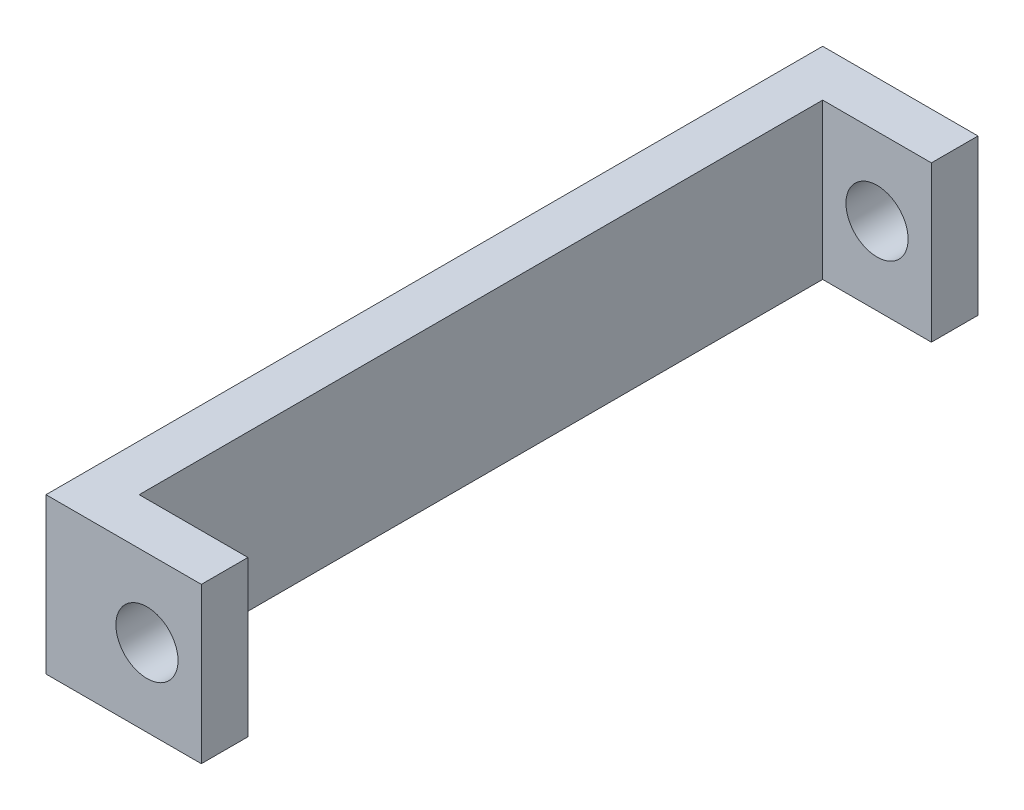
ISO-10303-21;
HEADER;
FILE_DESCRIPTION(('STEP AP214'),'2;1');
FILE_NAME('part.step','',(''),(''),'','','');
FILE_SCHEMA(('AUTOMOTIVE_DESIGN { 1 0 10303 214 1 1 1 1 }'));
ENDSEC;
DATA;
#1=APPLICATION_CONTEXT('core data for automotive mechanical design processes');
#2=APPLICATION_PROTOCOL_DEFINITION('international standard','automotive_design',2000,#1);
#3=PRODUCT_CONTEXT('',#1,'mechanical');
#4=PRODUCT('Part','Part','',(#3));
#5=PRODUCT_RELATED_PRODUCT_CATEGORY('part','',(#4));
#6=PRODUCT_DEFINITION_FORMATION('','',#4);
#7=PRODUCT_DEFINITION_CONTEXT('part definition',#1,'design');
#8=PRODUCT_DEFINITION('design','',#6,#7);
#9=PRODUCT_DEFINITION_SHAPE('','',#8);
#10=(LENGTH_UNIT() NAMED_UNIT(*) SI_UNIT(.MILLI.,.METRE.));
#11=(NAMED_UNIT(*) PLANE_ANGLE_UNIT() SI_UNIT($,.RADIAN.));
#12=(NAMED_UNIT(*) SI_UNIT($,.STERADIAN.) SOLID_ANGLE_UNIT());
#13=UNCERTAINTY_MEASURE_WITH_UNIT(LENGTH_MEASURE(1.E-05),#10,'distance_accuracy_value','');
#14=(GEOMETRIC_REPRESENTATION_CONTEXT(3) GLOBAL_UNCERTAINTY_ASSIGNED_CONTEXT((#13)) GLOBAL_UNIT_ASSIGNED_CONTEXT((#10,
#11,#12)) REPRESENTATION_CONTEXT('',''));
#15=CARTESIAN_POINT('',(0.,0.,0.));
#16=DIRECTION('',(0.,0.,1.));
#17=DIRECTION('',(1.,0.,0.));
#18=AXIS2_PLACEMENT_3D('',#15,#16,#17);
#19=CARTESIAN_POINT('',(5.,5.,50.));
#20=DIRECTION('',(-1.,0.,0.));
#21=DIRECTION('',(0.,0.,1.));
#22=AXIS2_PLACEMENT_3D('',#19,#20,#21);
#23=PLANE('',#22);
#24=DIRECTION('',(0.,0.,-1.));
#25=VECTOR('',#24,1.);
#26=CARTESIAN_POINT('',(5.,5.,50.));
#27=LINE('',#26,#25);
#28=CARTESIAN_POINT('',(5.,5.,3.));
#29=VERTEX_POINT('',#28);
#30=CARTESIAN_POINT('',(5.,5.,0.));
#31=VERTEX_POINT('',#30);
#32=EDGE_CURVE('E188',#29,#31,#27,.T.);
#33=ORIENTED_EDGE('',*,*,#32,.F.);
#34=DIRECTION('',(0.,1.,0.));
#35=VECTOR('',#34,1.);
#36=CARTESIAN_POINT('',(5.,-5.99999999999996,3.));
#37=LINE('',#36,#35);
#38=CARTESIAN_POINT('',(5.,-5.,3.));
#39=VERTEX_POINT('',#38);
#40=EDGE_CURVE('E134',#39,#29,#37,.T.);
#41=ORIENTED_EDGE('',*,*,#40,.F.);
#42=DIRECTION('',(0.,0.,-1.));
#43=VECTOR('',#42,1.);
#44=CARTESIAN_POINT('',(5.,-5.,50.));
#45=LINE('',#44,#43);
#46=CARTESIAN_POINT('',(5.,-5.,0.));
#47=VERTEX_POINT('',#46);
#48=EDGE_CURVE('E91',#39,#47,#45,.T.);
#49=ORIENTED_EDGE('',*,*,#48,.T.);
#50=DIRECTION('',(0.,1.,0.));
#51=VECTOR('',#50,1.);
#52=CARTESIAN_POINT('',(5.,5.,0.));
#53=LINE('',#52,#51);
#54=EDGE_CURVE('E148',#47,#31,#53,.T.);
#55=ORIENTED_EDGE('',*,*,#54,.T.);
#56=EDGE_LOOP('',(#33,#41,#49,#55));
#57=FACE_BOUND('',#56,.T.);
#58=ADVANCED_FACE('F43',(#57),#23,.F.);
#59=CARTESIAN_POINT('',(5.,-5.,50.));
#60=VERTEX_POINT('',#59);
#61=CARTESIAN_POINT('',(5.,-5.,47.));
#62=VERTEX_POINT('',#61);
#63=EDGE_CURVE('E176',#60,#62,#45,.T.);
#64=ORIENTED_EDGE('',*,*,#63,.T.);
#65=DIRECTION('',(0.,1.,0.));
#66=VECTOR('',#65,1.);
#67=CARTESIAN_POINT('',(5.,-5.99999999999996,47.));
#68=LINE('',#67,#66);
#69=CARTESIAN_POINT('',(5.,5.,47.));
#70=VERTEX_POINT('',#69);
#71=EDGE_CURVE('E149',#62,#70,#68,.T.);
#72=ORIENTED_EDGE('',*,*,#71,.T.);
#73=CARTESIAN_POINT('',(5.,5.,50.));
#74=VERTEX_POINT('',#73);
#75=EDGE_CURVE('E189',#74,#70,#27,.T.);
#76=ORIENTED_EDGE('',*,*,#75,.F.);
#77=DIRECTION('',(0.,1.,0.));
#78=VECTOR('',#77,1.);
#79=CARTESIAN_POINT('',(5.,5.,50.));
#80=LINE('',#79,#78);
#81=EDGE_CURVE('E155',#60,#74,#80,.T.);
#82=ORIENTED_EDGE('',*,*,#81,.F.);
#83=EDGE_LOOP('',(#64,#72,#76,#82));
#84=FACE_BOUND('',#83,.T.);
#85=ADVANCED_FACE('F45',(#84),#23,.F.);
#86=CARTESIAN_POINT('',(-5.,5.,50.));
#87=DIRECTION('',(0.,-1.,0.));
#88=DIRECTION('',(0.,0.,-1.));
#89=AXIS2_PLACEMENT_3D('',#86,#87,#88);
#90=PLANE('',#89);
#91=DIRECTION('',(0.,0.,1.));
#92=VECTOR('',#91,1.);
#93=CARTESIAN_POINT('',(-2.,5.,3.));
#94=LINE('',#93,#92);
#95=CARTESIAN_POINT('',(-2.,5.,3.));
#96=VERTEX_POINT('',#95);
#97=CARTESIAN_POINT('',(-1.99999999999999,5.,47.));
#98=VERTEX_POINT('',#97);
#99=EDGE_CURVE('E123',#96,#98,#94,.T.);
#100=ORIENTED_EDGE('',*,*,#99,.F.);
#101=DIRECTION('',(-1.,0.,0.));
#102=VECTOR('',#101,1.);
#103=CARTESIAN_POINT('',(5.,5.,3.));
#104=LINE('',#103,#102);
#105=EDGE_CURVE('E132',#29,#96,#104,.T.);
#106=ORIENTED_EDGE('',*,*,#105,.F.);
#107=ORIENTED_EDGE('',*,*,#32,.T.);
#108=DIRECTION('',(-1.,0.,0.));
#109=VECTOR('',#108,1.);
#110=CARTESIAN_POINT('',(-5.,5.,0.));
#111=LINE('',#110,#109);
#112=CARTESIAN_POINT('',(-5.,5.,0.));
#113=VERTEX_POINT('',#112);
#114=EDGE_CURVE('E168',#31,#113,#111,.T.);
#115=ORIENTED_EDGE('',*,*,#114,.T.);
#116=DIRECTION('',(0.,0.,-1.));
#117=VECTOR('',#116,1.);
#118=CARTESIAN_POINT('',(-5.,5.,50.));
#119=LINE('',#118,#117);
#120=CARTESIAN_POINT('',(-5.,5.,50.));
#121=VERTEX_POINT('',#120);
#122=EDGE_CURVE('E184',#121,#113,#119,.T.);
#123=ORIENTED_EDGE('',*,*,#122,.F.);
#124=DIRECTION('',(-1.,0.,0.));
#125=VECTOR('',#124,1.);
#126=CARTESIAN_POINT('',(-5.,5.,50.));
#127=LINE('',#126,#125);
#128=EDGE_CURVE('E99',#74,#121,#127,.T.);
#129=ORIENTED_EDGE('',*,*,#128,.F.);
#130=ORIENTED_EDGE('',*,*,#75,.T.);
#131=DIRECTION('',(1.,0.,0.));
#132=VECTOR('',#131,1.);
#133=CARTESIAN_POINT('',(5.,5.,47.));
#134=LINE('',#133,#132);
#135=EDGE_CURVE('E129',#98,#70,#134,.T.);
#136=ORIENTED_EDGE('',*,*,#135,.F.);
#137=EDGE_LOOP('',(#100,#106,#107,#115,#123,#129,#130,#136));
#138=FACE_BOUND('',#137,.T.);
#139=ADVANCED_FACE('F139',(#138),#90,.F.);
#140=CARTESIAN_POINT('',(-5.,5.,50.));
#141=DIRECTION('',(1.,0.,0.));
#142=DIRECTION('',(0.,1.,0.));
#143=AXIS2_PLACEMENT_3D('',#140,#141,#142);
#144=PLANE('',#143);
#145=DIRECTION('',(0.,-1.,0.));
#146=VECTOR('',#145,1.);
#147=CARTESIAN_POINT('',(-5.,5.,0.));
#148=LINE('',#147,#146);
#149=CARTESIAN_POINT('',(-5.,-5.,0.));
#150=VERTEX_POINT('',#149);
#151=EDGE_CURVE('E171',#113,#150,#148,.T.);
#152=ORIENTED_EDGE('',*,*,#151,.T.);
#153=DIRECTION('',(0.,0.,-1.));
#154=VECTOR('',#153,1.);
#155=CARTESIAN_POINT('',(-5.,-5.,50.));
#156=LINE('',#155,#154);
#157=CARTESIAN_POINT('',(-5.,-5.,50.));
#158=VERTEX_POINT('',#157);
#159=EDGE_CURVE('E180',#158,#150,#156,.T.);
#160=ORIENTED_EDGE('',*,*,#159,.F.);
#161=DIRECTION('',(0.,-1.,0.));
#162=VECTOR('',#161,1.);
#163=CARTESIAN_POINT('',(-5.,5.,50.));
#164=LINE('',#163,#162);
#165=EDGE_CURVE('E161',#121,#158,#164,.T.);
#166=ORIENTED_EDGE('',*,*,#165,.F.);
#167=ORIENTED_EDGE('',*,*,#122,.T.);
#168=EDGE_LOOP('',(#152,#160,#166,#167));
#169=FACE_BOUND('',#168,.T.);
#170=ADVANCED_FACE('F208',(#169),#144,.F.);
#171=CARTESIAN_POINT('',(-5.,-5.,50.));
#172=DIRECTION('',(0.,1.,0.));
#173=DIRECTION('',(0.,0.,1.));
#174=AXIS2_PLACEMENT_3D('',#171,#172,#173);
#175=PLANE('',#174);
#176=ORIENTED_EDGE('',*,*,#48,.F.);
#177=DIRECTION('',(-1.,0.,0.));
#178=VECTOR('',#177,1.);
#179=CARTESIAN_POINT('',(-4.99999999999999,-5.,3.));
#180=LINE('',#179,#178);
#181=CARTESIAN_POINT('',(-2.,-5.,3.));
#182=VERTEX_POINT('',#181);
#183=EDGE_CURVE('E11',#39,#182,#180,.T.);
#184=ORIENTED_EDGE('',*,*,#183,.T.);
#185=DIRECTION('',(0.,0.,1.));
#186=VECTOR('',#185,1.);
#187=CARTESIAN_POINT('',(-1.99999999999999,-5.,50.));
#188=LINE('',#187,#186);
#189=CARTESIAN_POINT('',(-1.99999999999999,-5.,47.));
#190=VERTEX_POINT('',#189);
#191=EDGE_CURVE('E126',#182,#190,#188,.T.);
#192=ORIENTED_EDGE('',*,*,#191,.T.);
#193=DIRECTION('',(1.,0.,0.));
#194=VECTOR('',#193,1.);
#195=CARTESIAN_POINT('',(-5.,-5.,47.));
#196=LINE('',#195,#194);
#197=EDGE_CURVE('E53',#190,#62,#196,.T.);
#198=ORIENTED_EDGE('',*,*,#197,.T.);
#199=ORIENTED_EDGE('',*,*,#63,.F.);
#200=DIRECTION('',(1.,0.,0.));
#201=VECTOR('',#200,1.);
#202=CARTESIAN_POINT('',(-5.,-5.,50.));
#203=LINE('',#202,#201);
#204=EDGE_CURVE('E69',#158,#60,#203,.T.);
#205=ORIENTED_EDGE('',*,*,#204,.F.);
#206=ORIENTED_EDGE('',*,*,#159,.T.);
#207=DIRECTION('',(1.,0.,0.));
#208=VECTOR('',#207,1.);
#209=CARTESIAN_POINT('',(-5.,-5.,0.));
#210=LINE('',#209,#208);
#211=EDGE_CURVE('E158',#150,#47,#210,.T.);
#212=ORIENTED_EDGE('',*,*,#211,.T.);
#213=EDGE_LOOP('',(#176,#184,#192,#198,#199,#205,#206,#212));
#214=FACE_BOUND('',#213,.T.);
#215=ADVANCED_FACE('F197',(#214),#175,.F.);
#216=CARTESIAN_POINT('',(0.,0.,50.));
#217=DIRECTION('',(0.,0.,1.));
#218=DIRECTION('',(1.,0.,0.));
#219=AXIS2_PLACEMENT_3D('',#216,#217,#218);
#220=PLANE('',#219);
#221=CARTESIAN_POINT('',(1.5,0.,50.));
#222=DIRECTION('',(0.,0.,1.));
#223=DIRECTION('',(1.,0.,0.));
#224=AXIS2_PLACEMENT_3D('',#221,#222,#223);
#225=CIRCLE('',#224,2.);
#226=CARTESIAN_POINT('',(3.5,0.,50.));
#227=VERTEX_POINT('',#226);
#228=EDGE_CURVE('E262',#227,#227,#225,.T.);
#229=ORIENTED_EDGE('',*,*,#228,.F.);
#230=EDGE_LOOP('',(#229));
#231=FACE_BOUND('',#230,.T.);
#232=ORIENTED_EDGE('',*,*,#81,.T.);
#233=ORIENTED_EDGE('',*,*,#128,.T.);
#234=ORIENTED_EDGE('',*,*,#165,.T.);
#235=ORIENTED_EDGE('',*,*,#204,.T.);
#236=EDGE_LOOP('',(#232,#233,#234,#235));
#237=FACE_BOUND('',#236,.T.);
#238=ADVANCED_FACE('F202',(#231,#237),#220,.T.);
#239=CARTESIAN_POINT('',(0.,0.,0.));
#240=DIRECTION('',(0.,0.,1.));
#241=DIRECTION('',(1.,0.,0.));
#242=AXIS2_PLACEMENT_3D('',#239,#240,#241);
#243=PLANE('',#242);
#244=CARTESIAN_POINT('',(1.5,0.,0.));
#245=DIRECTION('',(0.,0.,1.));
#246=DIRECTION('',(1.,0.,0.));
#247=AXIS2_PLACEMENT_3D('',#244,#245,#246);
#248=CIRCLE('',#247,2.);
#249=CARTESIAN_POINT('',(3.5,0.,0.));
#250=VERTEX_POINT('',#249);
#251=EDGE_CURVE('E137',#250,#250,#248,.T.);
#252=ORIENTED_EDGE('',*,*,#251,.T.);
#253=EDGE_LOOP('',(#252));
#254=FACE_BOUND('',#253,.T.);
#255=ORIENTED_EDGE('',*,*,#54,.F.);
#256=ORIENTED_EDGE('',*,*,#211,.F.);
#257=ORIENTED_EDGE('',*,*,#151,.F.);
#258=ORIENTED_EDGE('',*,*,#114,.F.);
#259=EDGE_LOOP('',(#255,#256,#257,#258));
#260=FACE_BOUND('',#259,.T.);
#261=ADVANCED_FACE('F212',(#254,#260),#243,.F.);
#262=CARTESIAN_POINT('',(5.,-5.99999999999996,3.));
#263=DIRECTION('',(0.,0.,-1.));
#264=DIRECTION('',(-1.,0.,0.));
#265=AXIS2_PLACEMENT_3D('',#262,#263,#264);
#266=PLANE('',#265);
#267=CARTESIAN_POINT('',(1.5,0.,3.));
#268=DIRECTION('',(0.,0.,-1.));
#269=DIRECTION('',(-1.,0.,0.));
#270=AXIS2_PLACEMENT_3D('',#267,#268,#269);
#271=CIRCLE('',#270,2.);
#272=CARTESIAN_POINT('',(-0.5,0.,3.));
#273=VERTEX_POINT('',#272);
#274=EDGE_CURVE('E255',#273,#273,#271,.T.);
#275=ORIENTED_EDGE('',*,*,#274,.T.);
#276=EDGE_LOOP('',(#275));
#277=FACE_BOUND('',#276,.T.);
#278=ORIENTED_EDGE('',*,*,#40,.T.);
#279=ORIENTED_EDGE('',*,*,#105,.T.);
#280=DIRECTION('',(0.,1.,0.));
#281=VECTOR('',#280,1.);
#282=CARTESIAN_POINT('',(-2.,-5.99999999999996,3.));
#283=LINE('',#282,#281);
#284=EDGE_CURVE('E119',#182,#96,#283,.T.);
#285=ORIENTED_EDGE('',*,*,#284,.F.);
#286=ORIENTED_EDGE('',*,*,#183,.F.);
#287=EDGE_LOOP('',(#278,#279,#285,#286));
#288=FACE_BOUND('',#287,.T.);
#289=ADVANCED_FACE('F133',(#277,#288),#266,.F.);
#290=CARTESIAN_POINT('',(5.,-5.99999999999996,47.));
#291=DIRECTION('',(0.,0.,1.));
#292=DIRECTION('',(1.,0.,0.));
#293=AXIS2_PLACEMENT_3D('',#290,#291,#292);
#294=PLANE('',#293);
#295=CARTESIAN_POINT('',(1.5,0.,47.));
#296=DIRECTION('',(0.,0.,1.));
#297=DIRECTION('',(1.,0.,0.));
#298=AXIS2_PLACEMENT_3D('',#295,#296,#297);
#299=CIRCLE('',#298,2.);
#300=CARTESIAN_POINT('',(3.5,0.,47.));
#301=VERTEX_POINT('',#300);
#302=EDGE_CURVE('E47',#301,#301,#299,.T.);
#303=ORIENTED_EDGE('',*,*,#302,.T.);
#304=EDGE_LOOP('',(#303));
#305=FACE_BOUND('',#304,.T.);
#306=DIRECTION('',(0.,1.,0.));
#307=VECTOR('',#306,1.);
#308=CARTESIAN_POINT('',(-1.99999999999999,-5.99999999999996,47.));
#309=LINE('',#308,#307);
#310=EDGE_CURVE('E60',#190,#98,#309,.T.);
#311=ORIENTED_EDGE('',*,*,#310,.T.);
#312=ORIENTED_EDGE('',*,*,#135,.T.);
#313=ORIENTED_EDGE('',*,*,#71,.F.);
#314=ORIENTED_EDGE('',*,*,#197,.F.);
#315=EDGE_LOOP('',(#311,#312,#313,#314));
#316=FACE_BOUND('',#315,.T.);
#317=ADVANCED_FACE('F237',(#305,#316),#294,.F.);
#318=CARTESIAN_POINT('',(-2.,-5.99999999999996,3.));
#319=DIRECTION('',(-1.,0.,0.));
#320=DIRECTION('',(0.,0.,1.));
#321=AXIS2_PLACEMENT_3D('',#318,#319,#320);
#322=PLANE('',#321);
#323=ORIENTED_EDGE('',*,*,#284,.T.);
#324=ORIENTED_EDGE('',*,*,#99,.T.);
#325=ORIENTED_EDGE('',*,*,#310,.F.);
#326=ORIENTED_EDGE('',*,*,#191,.F.);
#327=EDGE_LOOP('',(#323,#324,#325,#326));
#328=FACE_BOUND('',#327,.T.);
#329=ADVANCED_FACE('F121',(#328),#322,.F.);
#330=CARTESIAN_POINT('',(1.5,0.,-21.));
#331=DIRECTION('',(0.,0.,1.));
#332=DIRECTION('',(1.,0.,0.));
#333=AXIS2_PLACEMENT_3D('',#330,#331,#332);
#334=CYLINDRICAL_SURFACE('',#333,2.);
#335=ORIENTED_EDGE('',*,*,#228,.T.);
#336=EDGE_LOOP('',(#335));
#337=FACE_BOUND('',#336,.T.);
#338=ORIENTED_EDGE('',*,*,#302,.F.);
#339=EDGE_LOOP('',(#338));
#340=FACE_BOUND('',#339,.T.);
#341=ADVANCED_FACE('F241',(#337,#340),#334,.F.);
#342=ORIENTED_EDGE('',*,*,#274,.F.);
#343=EDGE_LOOP('',(#342));
#344=FACE_BOUND('',#343,.T.);
#345=ORIENTED_EDGE('',*,*,#251,.F.);
#346=EDGE_LOOP('',(#345));
#347=FACE_BOUND('',#346,.T.);
#348=ADVANCED_FACE('F245',(#344,#347),#334,.F.);
#349=CLOSED_SHELL('',(#58,#85,#139,#170,#215,#238,#261,#289,#317,#329,#341,#348));
#350=MANIFOLD_SOLID_BREP('B2',#349);
#351=ADVANCED_BREP_SHAPE_REPRESENTATION('',(#18,#350),#14);
#352=SHAPE_DEFINITION_REPRESENTATION(#9,#351);
ENDSEC;
END-ISO-10303-21;
